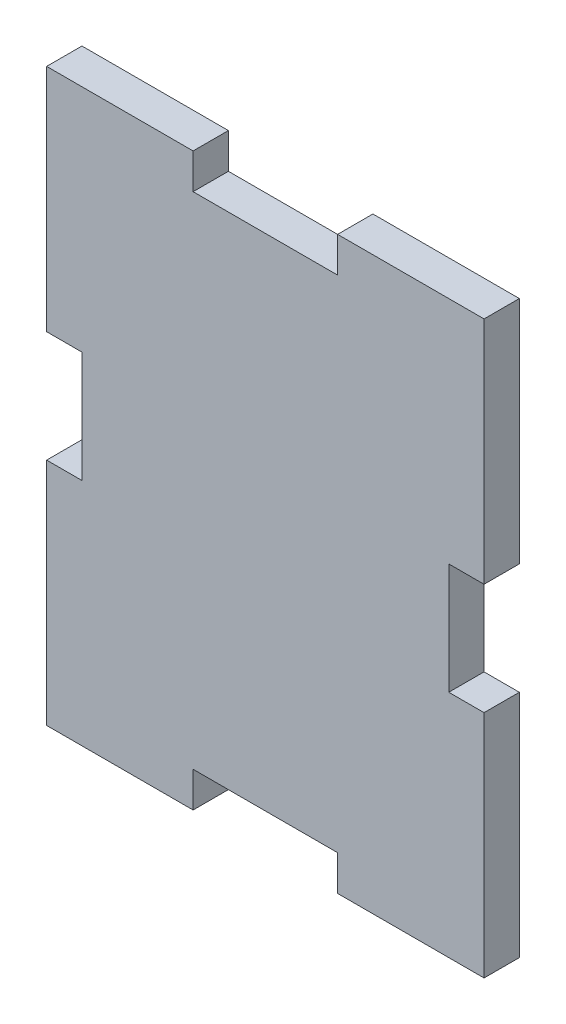
ISO-10303-21;
HEADER;
FILE_DESCRIPTION(('STEP AP214'),'2;1');
FILE_NAME('part.step','',(''),(''),'','','');
FILE_SCHEMA(('AUTOMOTIVE_DESIGN { 1 0 10303 214 1 1 1 1 }'));
ENDSEC;
DATA;
#1=APPLICATION_CONTEXT('core data for automotive mechanical design processes');
#2=APPLICATION_PROTOCOL_DEFINITION('international standard','automotive_design',2000,#1);
#3=PRODUCT_CONTEXT('',#1,'mechanical');
#4=PRODUCT('Part','Part','',(#3));
#5=PRODUCT_RELATED_PRODUCT_CATEGORY('part','',(#4));
#6=PRODUCT_DEFINITION_FORMATION('','',#4);
#7=PRODUCT_DEFINITION_CONTEXT('part definition',#1,'design');
#8=PRODUCT_DEFINITION('design','',#6,#7);
#9=PRODUCT_DEFINITION_SHAPE('','',#8);
#10=(LENGTH_UNIT() NAMED_UNIT(*) SI_UNIT(.MILLI.,.METRE.));
#11=(NAMED_UNIT(*) PLANE_ANGLE_UNIT() SI_UNIT($,.RADIAN.));
#12=(NAMED_UNIT(*) SI_UNIT($,.STERADIAN.) SOLID_ANGLE_UNIT());
#13=UNCERTAINTY_MEASURE_WITH_UNIT(LENGTH_MEASURE(1.E-05),#10,'distance_accuracy_value','');
#14=(GEOMETRIC_REPRESENTATION_CONTEXT(3) GLOBAL_UNCERTAINTY_ASSIGNED_CONTEXT((#13)) GLOBAL_UNIT_ASSIGNED_CONTEXT((#10,
#11,#12)) REPRESENTATION_CONTEXT('',''));
#15=CARTESIAN_POINT('',(0.,0.,0.));
#16=DIRECTION('',(0.,0.,1.));
#17=DIRECTION('',(1.,0.,0.));
#18=AXIS2_PLACEMENT_3D('',#15,#16,#17);
#19=CARTESIAN_POINT('',(0.,0.,6.35));
#20=DIRECTION('',(0.,1.,0.));
#21=DIRECTION('',(0.,0.,1.));
#22=AXIS2_PLACEMENT_3D('',#19,#20,#21);
#23=PLANE('',#22);
#24=DIRECTION('',(1.,0.,0.));
#25=VECTOR('',#24,1.);
#26=CARTESIAN_POINT('',(0.,0.,0.));
#27=LINE('',#26,#25);
#28=CARTESIAN_POINT('',(0.,0.,0.));
#29=VERTEX_POINT('',#28);
#30=CARTESIAN_POINT('',(26.35,0.,0.));
#31=VERTEX_POINT('',#30);
#32=EDGE_CURVE('E201',#29,#31,#27,.T.);
#33=ORIENTED_EDGE('',*,*,#32,.T.);
#34=DIRECTION('',(0.,0.,-1.));
#35=VECTOR('',#34,1.);
#36=CARTESIAN_POINT('',(26.35,0.,6.35));
#37=LINE('',#36,#35);
#38=CARTESIAN_POINT('',(26.35,0.,6.35));
#39=VERTEX_POINT('',#38);
#40=EDGE_CURVE('E11',#39,#31,#37,.T.);
#41=ORIENTED_EDGE('',*,*,#40,.F.);
#42=DIRECTION('',(1.,0.,0.));
#43=VECTOR('',#42,1.);
#44=CARTESIAN_POINT('',(0.,0.,6.35));
#45=LINE('',#44,#43);
#46=CARTESIAN_POINT('',(0.,0.,6.35));
#47=VERTEX_POINT('',#46);
#48=EDGE_CURVE('E239',#47,#39,#45,.T.);
#49=ORIENTED_EDGE('',*,*,#48,.F.);
#50=DIRECTION('',(0.,0.,-1.));
#51=VECTOR('',#50,1.);
#52=CARTESIAN_POINT('',(0.,0.,6.35));
#53=LINE('',#52,#51);
#54=EDGE_CURVE('E197',#47,#29,#53,.T.);
#55=ORIENTED_EDGE('',*,*,#54,.T.);
#56=EDGE_LOOP('',(#33,#41,#49,#55));
#57=FACE_BOUND('',#56,.T.);
#58=ADVANCED_FACE('F33',(#57),#23,.F.);
#59=CARTESIAN_POINT('',(26.35,0.,6.35));
#60=DIRECTION('',(-1.,0.,0.));
#61=DIRECTION('',(0.,0.,1.));
#62=AXIS2_PLACEMENT_3D('',#59,#60,#61);
#63=PLANE('',#62);
#64=DIRECTION('',(0.,1.,0.));
#65=VECTOR('',#64,1.);
#66=CARTESIAN_POINT('',(26.35,0.,0.));
#67=LINE('',#66,#65);
#68=CARTESIAN_POINT('',(26.35,6.35,0.));
#69=VERTEX_POINT('',#68);
#70=EDGE_CURVE('E204',#31,#69,#67,.T.);
#71=ORIENTED_EDGE('',*,*,#70,.T.);
#72=DIRECTION('',(0.,0.,-1.));
#73=VECTOR('',#72,1.);
#74=CARTESIAN_POINT('',(26.35,6.35,6.35));
#75=LINE('',#74,#73);
#76=CARTESIAN_POINT('',(26.35,6.35,6.35));
#77=VERTEX_POINT('',#76);
#78=EDGE_CURVE('E41',#77,#69,#75,.T.);
#79=ORIENTED_EDGE('',*,*,#78,.F.);
#80=DIRECTION('',(0.,1.,0.));
#81=VECTOR('',#80,1.);
#82=CARTESIAN_POINT('',(26.35,0.,6.35));
#83=LINE('',#82,#81);
#84=EDGE_CURVE('E128',#39,#77,#83,.T.);
#85=ORIENTED_EDGE('',*,*,#84,.F.);
#86=ORIENTED_EDGE('',*,*,#40,.T.);
#87=EDGE_LOOP('',(#71,#79,#85,#86));
#88=FACE_BOUND('',#87,.T.);
#89=ADVANCED_FACE('F357',(#88),#63,.F.);
#90=CARTESIAN_POINT('',(26.35,6.35,6.35));
#91=DIRECTION('',(0.,1.,0.));
#92=DIRECTION('',(-1.,0.,0.));
#93=AXIS2_PLACEMENT_3D('',#90,#91,#92);
#94=PLANE('',#93);
#95=DIRECTION('',(1.,0.,0.));
#96=VECTOR('',#95,1.);
#97=CARTESIAN_POINT('',(26.35,6.35,0.));
#98=LINE('',#97,#96);
#99=CARTESIAN_POINT('',(52.35,6.35,0.));
#100=VERTEX_POINT('',#99);
#101=EDGE_CURVE('E206',#69,#100,#98,.T.);
#102=ORIENTED_EDGE('',*,*,#101,.T.);
#103=DIRECTION('',(0.,0.,-1.));
#104=VECTOR('',#103,1.);
#105=CARTESIAN_POINT('',(52.35,6.35,6.35));
#106=LINE('',#105,#104);
#107=CARTESIAN_POINT('',(52.35,6.35,6.35));
#108=VERTEX_POINT('',#107);
#109=EDGE_CURVE('E282',#108,#100,#106,.T.);
#110=ORIENTED_EDGE('',*,*,#109,.F.);
#111=DIRECTION('',(1.,0.,0.));
#112=VECTOR('',#111,1.);
#113=CARTESIAN_POINT('',(26.35,6.35,6.35));
#114=LINE('',#113,#112);
#115=EDGE_CURVE('E290',#77,#108,#114,.T.);
#116=ORIENTED_EDGE('',*,*,#115,.F.);
#117=ORIENTED_EDGE('',*,*,#78,.T.);
#118=EDGE_LOOP('',(#102,#110,#116,#117));
#119=FACE_BOUND('',#118,.T.);
#120=ADVANCED_FACE('F288',(#119),#94,.F.);
#121=CARTESIAN_POINT('',(52.35,6.35,6.35));
#122=DIRECTION('',(1.,0.,0.));
#123=DIRECTION('',(0.,1.,0.));
#124=AXIS2_PLACEMENT_3D('',#121,#122,#123);
#125=PLANE('',#124);
#126=DIRECTION('',(0.,-1.,0.));
#127=VECTOR('',#126,1.);
#128=CARTESIAN_POINT('',(52.35,6.35,0.));
#129=LINE('',#128,#127);
#130=CARTESIAN_POINT('',(52.35,0.,0.));
#131=VERTEX_POINT('',#130);
#132=EDGE_CURVE('E208',#100,#131,#129,.T.);
#133=ORIENTED_EDGE('',*,*,#132,.T.);
#134=DIRECTION('',(0.,0.,-1.));
#135=VECTOR('',#134,1.);
#136=CARTESIAN_POINT('',(52.35,0.,6.35));
#137=LINE('',#136,#135);
#138=CARTESIAN_POINT('',(52.35,0.,6.35));
#139=VERTEX_POINT('',#138);
#140=EDGE_CURVE('E279',#139,#131,#137,.T.);
#141=ORIENTED_EDGE('',*,*,#140,.F.);
#142=DIRECTION('',(0.,-1.,0.));
#143=VECTOR('',#142,1.);
#144=CARTESIAN_POINT('',(52.35,6.35,6.35));
#145=LINE('',#144,#143);
#146=EDGE_CURVE('E308',#108,#139,#145,.T.);
#147=ORIENTED_EDGE('',*,*,#146,.F.);
#148=ORIENTED_EDGE('',*,*,#109,.T.);
#149=EDGE_LOOP('',(#133,#141,#147,#148));
#150=FACE_BOUND('',#149,.T.);
#151=ADVANCED_FACE('F299',(#150),#125,.F.);
#152=CARTESIAN_POINT('',(52.35,0.,6.35));
#153=DIRECTION('',(0.,1.,0.));
#154=DIRECTION('',(0.,0.,1.));
#155=AXIS2_PLACEMENT_3D('',#152,#153,#154);
#156=PLANE('',#155);
#157=DIRECTION('',(1.,0.,0.));
#158=VECTOR('',#157,1.);
#159=CARTESIAN_POINT('',(52.35,0.,0.));
#160=LINE('',#159,#158);
#161=CARTESIAN_POINT('',(78.7,0.,0.));
#162=VERTEX_POINT('',#161);
#163=EDGE_CURVE('E210',#131,#162,#160,.T.);
#164=ORIENTED_EDGE('',*,*,#163,.T.);
#165=DIRECTION('',(0.,0.,-1.));
#166=VECTOR('',#165,1.);
#167=CARTESIAN_POINT('',(78.7,0.,6.35));
#168=LINE('',#167,#166);
#169=CARTESIAN_POINT('',(78.7,0.,6.35));
#170=VERTEX_POINT('',#169);
#171=EDGE_CURVE('E276',#170,#162,#168,.T.);
#172=ORIENTED_EDGE('',*,*,#171,.F.);
#173=DIRECTION('',(1.,0.,0.));
#174=VECTOR('',#173,1.);
#175=CARTESIAN_POINT('',(52.35,0.,6.35));
#176=LINE('',#175,#174);
#177=EDGE_CURVE('E305',#139,#170,#176,.T.);
#178=ORIENTED_EDGE('',*,*,#177,.F.);
#179=ORIENTED_EDGE('',*,*,#140,.T.);
#180=EDGE_LOOP('',(#164,#172,#178,#179));
#181=FACE_BOUND('',#180,.T.);
#182=ADVANCED_FACE('F303',(#181),#156,.F.);
#183=CARTESIAN_POINT('',(78.7,41.35,6.35));
#184=DIRECTION('',(-1.,0.,0.));
#185=DIRECTION('',(0.,0.,1.));
#186=AXIS2_PLACEMENT_3D('',#183,#184,#185);
#187=PLANE('',#186);
#188=DIRECTION('',(0.,1.,0.));
#189=VECTOR('',#188,1.);
#190=CARTESIAN_POINT('',(78.7,41.35,0.));
#191=LINE('',#190,#189);
#192=CARTESIAN_POINT('',(78.7,41.35,0.));
#193=VERTEX_POINT('',#192);
#194=EDGE_CURVE('E212',#162,#193,#191,.T.);
#195=ORIENTED_EDGE('',*,*,#194,.T.);
#196=DIRECTION('',(0.,0.,-1.));
#197=VECTOR('',#196,1.);
#198=CARTESIAN_POINT('',(78.7,41.35,6.35));
#199=LINE('',#198,#197);
#200=CARTESIAN_POINT('',(78.7,41.35,6.35));
#201=VERTEX_POINT('',#200);
#202=EDGE_CURVE('E273',#201,#193,#199,.T.);
#203=ORIENTED_EDGE('',*,*,#202,.F.);
#204=DIRECTION('',(0.,1.,0.));
#205=VECTOR('',#204,1.);
#206=CARTESIAN_POINT('',(78.7,41.35,6.35));
#207=LINE('',#206,#205);
#208=EDGE_CURVE('E307',#170,#201,#207,.T.);
#209=ORIENTED_EDGE('',*,*,#208,.F.);
#210=ORIENTED_EDGE('',*,*,#171,.T.);
#211=EDGE_LOOP('',(#195,#203,#209,#210));
#212=FACE_BOUND('',#211,.T.);
#213=ADVANCED_FACE('F370',(#212),#187,.F.);
#214=CARTESIAN_POINT('',(72.35,41.35,6.35));
#215=DIRECTION('',(0.,-1.,0.));
#216=DIRECTION('',(0.,0.,-1.));
#217=AXIS2_PLACEMENT_3D('',#214,#215,#216);
#218=PLANE('',#217);
#219=DIRECTION('',(-1.,0.,0.));
#220=VECTOR('',#219,1.);
#221=CARTESIAN_POINT('',(72.35,41.35,0.));
#222=LINE('',#221,#220);
#223=CARTESIAN_POINT('',(72.35,41.35,0.));
#224=VERTEX_POINT('',#223);
#225=EDGE_CURVE('E214',#193,#224,#222,.T.);
#226=ORIENTED_EDGE('',*,*,#225,.T.);
#227=DIRECTION('',(0.,0.,-1.));
#228=VECTOR('',#227,1.);
#229=CARTESIAN_POINT('',(72.35,41.35,6.35));
#230=LINE('',#229,#228);
#231=CARTESIAN_POINT('',(72.35,41.35,6.35));
#232=VERTEX_POINT('',#231);
#233=EDGE_CURVE('E270',#232,#224,#230,.T.);
#234=ORIENTED_EDGE('',*,*,#233,.F.);
#235=DIRECTION('',(-1.,0.,0.));
#236=VECTOR('',#235,1.);
#237=CARTESIAN_POINT('',(72.35,41.35,6.35));
#238=LINE('',#237,#236);
#239=EDGE_CURVE('E310',#201,#232,#238,.T.);
#240=ORIENTED_EDGE('',*,*,#239,.F.);
#241=ORIENTED_EDGE('',*,*,#202,.T.);
#242=EDGE_LOOP('',(#226,#234,#240,#241));
#243=FACE_BOUND('',#242,.T.);
#244=ADVANCED_FACE('F373',(#243),#218,.F.);
#245=CARTESIAN_POINT('',(72.35,61.35,6.35));
#246=DIRECTION('',(-1.,0.,0.));
#247=DIRECTION('',(0.,0.,1.));
#248=AXIS2_PLACEMENT_3D('',#245,#246,#247);
#249=PLANE('',#248);
#250=DIRECTION('',(0.,1.,0.));
#251=VECTOR('',#250,1.);
#252=CARTESIAN_POINT('',(72.35,61.35,0.));
#253=LINE('',#252,#251);
#254=CARTESIAN_POINT('',(72.35,61.35,0.));
#255=VERTEX_POINT('',#254);
#256=EDGE_CURVE('E216',#224,#255,#253,.T.);
#257=ORIENTED_EDGE('',*,*,#256,.T.);
#258=DIRECTION('',(0.,0.,-1.));
#259=VECTOR('',#258,1.);
#260=CARTESIAN_POINT('',(72.35,61.35,6.35));
#261=LINE('',#260,#259);
#262=CARTESIAN_POINT('',(72.35,61.35,6.35));
#263=VERTEX_POINT('',#262);
#264=EDGE_CURVE('E267',#263,#255,#261,.T.);
#265=ORIENTED_EDGE('',*,*,#264,.F.);
#266=DIRECTION('',(0.,1.,0.));
#267=VECTOR('',#266,1.);
#268=CARTESIAN_POINT('',(72.35,61.35,6.35));
#269=LINE('',#268,#267);
#270=EDGE_CURVE('E316',#232,#263,#269,.T.);
#271=ORIENTED_EDGE('',*,*,#270,.F.);
#272=ORIENTED_EDGE('',*,*,#233,.T.);
#273=EDGE_LOOP('',(#257,#265,#271,#272));
#274=FACE_BOUND('',#273,.T.);
#275=ADVANCED_FACE('F377',(#274),#249,.F.);
#276=CARTESIAN_POINT('',(78.7,61.35,6.35));
#277=DIRECTION('',(0.,1.,0.));
#278=DIRECTION('',(0.,0.,1.));
#279=AXIS2_PLACEMENT_3D('',#276,#277,#278);
#280=PLANE('',#279);
#281=DIRECTION('',(1.,0.,0.));
#282=VECTOR('',#281,1.);
#283=CARTESIAN_POINT('',(78.7,61.35,0.));
#284=LINE('',#283,#282);
#285=CARTESIAN_POINT('',(78.7,61.35,0.));
#286=VERTEX_POINT('',#285);
#287=EDGE_CURVE('E218',#255,#286,#284,.T.);
#288=ORIENTED_EDGE('',*,*,#287,.T.);
#289=DIRECTION('',(0.,0.,-1.));
#290=VECTOR('',#289,1.);
#291=CARTESIAN_POINT('',(78.7,61.35,6.35));
#292=LINE('',#291,#290);
#293=CARTESIAN_POINT('',(78.7,61.35,6.35));
#294=VERTEX_POINT('',#293);
#295=EDGE_CURVE('E264',#294,#286,#292,.T.);
#296=ORIENTED_EDGE('',*,*,#295,.F.);
#297=DIRECTION('',(1.,0.,0.));
#298=VECTOR('',#297,1.);
#299=CARTESIAN_POINT('',(78.7,61.35,6.35));
#300=LINE('',#299,#298);
#301=EDGE_CURVE('E318',#263,#294,#300,.T.);
#302=ORIENTED_EDGE('',*,*,#301,.F.);
#303=ORIENTED_EDGE('',*,*,#264,.T.);
#304=EDGE_LOOP('',(#288,#296,#302,#303));
#305=FACE_BOUND('',#304,.T.);
#306=ADVANCED_FACE('F381',(#305),#280,.F.);
#307=CARTESIAN_POINT('',(78.7,102.7,6.35));
#308=DIRECTION('',(-1.,0.,0.));
#309=DIRECTION('',(0.,-1.,0.));
#310=AXIS2_PLACEMENT_3D('',#307,#308,#309);
#311=PLANE('',#310);
#312=DIRECTION('',(0.,1.,0.));
#313=VECTOR('',#312,1.);
#314=CARTESIAN_POINT('',(78.7,102.7,0.));
#315=LINE('',#314,#313);
#316=CARTESIAN_POINT('',(78.7,102.7,0.));
#317=VERTEX_POINT('',#316);
#318=EDGE_CURVE('E220',#286,#317,#315,.T.);
#319=ORIENTED_EDGE('',*,*,#318,.T.);
#320=DIRECTION('',(0.,0.,-1.));
#321=VECTOR('',#320,1.);
#322=CARTESIAN_POINT('',(78.7,102.7,6.35));
#323=LINE('',#322,#321);
#324=CARTESIAN_POINT('',(78.7,102.7,6.35));
#325=VERTEX_POINT('',#324);
#326=EDGE_CURVE('E261',#325,#317,#323,.T.);
#327=ORIENTED_EDGE('',*,*,#326,.F.);
#328=DIRECTION('',(0.,1.,0.));
#329=VECTOR('',#328,1.);
#330=CARTESIAN_POINT('',(78.7,102.7,6.35));
#331=LINE('',#330,#329);
#332=EDGE_CURVE('E320',#294,#325,#331,.T.);
#333=ORIENTED_EDGE('',*,*,#332,.F.);
#334=ORIENTED_EDGE('',*,*,#295,.T.);
#335=EDGE_LOOP('',(#319,#327,#333,#334));
#336=FACE_BOUND('',#335,.T.);
#337=ADVANCED_FACE('F385',(#336),#311,.F.);
#338=CARTESIAN_POINT('',(52.35,102.7,6.35));
#339=DIRECTION('',(0.,-1.,0.));
#340=DIRECTION('',(0.,0.,-1.));
#341=AXIS2_PLACEMENT_3D('',#338,#339,#340);
#342=PLANE('',#341);
#343=DIRECTION('',(-1.,0.,0.));
#344=VECTOR('',#343,1.);
#345=CARTESIAN_POINT('',(52.35,102.7,0.));
#346=LINE('',#345,#344);
#347=CARTESIAN_POINT('',(52.35,102.7,0.));
#348=VERTEX_POINT('',#347);
#349=EDGE_CURVE('E222',#317,#348,#346,.T.);
#350=ORIENTED_EDGE('',*,*,#349,.T.);
#351=DIRECTION('',(0.,0.,-1.));
#352=VECTOR('',#351,1.);
#353=CARTESIAN_POINT('',(52.35,102.7,6.35));
#354=LINE('',#353,#352);
#355=CARTESIAN_POINT('',(52.35,102.7,6.35));
#356=VERTEX_POINT('',#355);
#357=EDGE_CURVE('E258',#356,#348,#354,.T.);
#358=ORIENTED_EDGE('',*,*,#357,.F.);
#359=DIRECTION('',(-1.,0.,0.));
#360=VECTOR('',#359,1.);
#361=CARTESIAN_POINT('',(52.35,102.7,6.35));
#362=LINE('',#361,#360);
#363=EDGE_CURVE('E322',#325,#356,#362,.T.);
#364=ORIENTED_EDGE('',*,*,#363,.F.);
#365=ORIENTED_EDGE('',*,*,#326,.T.);
#366=EDGE_LOOP('',(#350,#358,#364,#365));
#367=FACE_BOUND('',#366,.T.);
#368=ADVANCED_FACE('F389',(#367),#342,.F.);
#369=CARTESIAN_POINT('',(52.35,96.35,6.35));
#370=DIRECTION('',(1.,0.,0.));
#371=DIRECTION('',(0.,0.,-1.));
#372=AXIS2_PLACEMENT_3D('',#369,#370,#371);
#373=PLANE('',#372);
#374=DIRECTION('',(0.,-1.,0.));
#375=VECTOR('',#374,1.);
#376=CARTESIAN_POINT('',(52.35,96.35,0.));
#377=LINE('',#376,#375);
#378=CARTESIAN_POINT('',(52.35,96.35,0.));
#379=VERTEX_POINT('',#378);
#380=EDGE_CURVE('E224',#348,#379,#377,.T.);
#381=ORIENTED_EDGE('',*,*,#380,.T.);
#382=DIRECTION('',(0.,0.,-1.));
#383=VECTOR('',#382,1.);
#384=CARTESIAN_POINT('',(52.35,96.35,6.35));
#385=LINE('',#384,#383);
#386=CARTESIAN_POINT('',(52.35,96.35,6.35));
#387=VERTEX_POINT('',#386);
#388=EDGE_CURVE('E255',#387,#379,#385,.T.);
#389=ORIENTED_EDGE('',*,*,#388,.F.);
#390=DIRECTION('',(0.,-1.,0.));
#391=VECTOR('',#390,1.);
#392=CARTESIAN_POINT('',(52.35,96.35,6.35));
#393=LINE('',#392,#391);
#394=EDGE_CURVE('E324',#356,#387,#393,.T.);
#395=ORIENTED_EDGE('',*,*,#394,.F.);
#396=ORIENTED_EDGE('',*,*,#357,.T.);
#397=EDGE_LOOP('',(#381,#389,#395,#396));
#398=FACE_BOUND('',#397,.T.);
#399=ADVANCED_FACE('F393',(#398),#373,.F.);
#400=CARTESIAN_POINT('',(26.35,96.35,6.35));
#401=DIRECTION('',(0.,-1.,0.));
#402=DIRECTION('',(1.,0.,0.));
#403=AXIS2_PLACEMENT_3D('',#400,#401,#402);
#404=PLANE('',#403);
#405=DIRECTION('',(-1.,0.,0.));
#406=VECTOR('',#405,1.);
#407=CARTESIAN_POINT('',(26.35,96.35,0.));
#408=LINE('',#407,#406);
#409=CARTESIAN_POINT('',(26.35,96.35,0.));
#410=VERTEX_POINT('',#409);
#411=EDGE_CURVE('E226',#379,#410,#408,.T.);
#412=ORIENTED_EDGE('',*,*,#411,.T.);
#413=DIRECTION('',(0.,0.,-1.));
#414=VECTOR('',#413,1.);
#415=CARTESIAN_POINT('',(26.35,96.35,6.35));
#416=LINE('',#415,#414);
#417=CARTESIAN_POINT('',(26.35,96.35,6.35));
#418=VERTEX_POINT('',#417);
#419=EDGE_CURVE('E252',#418,#410,#416,.T.);
#420=ORIENTED_EDGE('',*,*,#419,.F.);
#421=DIRECTION('',(-1.,0.,0.));
#422=VECTOR('',#421,1.);
#423=CARTESIAN_POINT('',(26.35,96.35,6.35));
#424=LINE('',#423,#422);
#425=EDGE_CURVE('E326',#387,#418,#424,.T.);
#426=ORIENTED_EDGE('',*,*,#425,.F.);
#427=ORIENTED_EDGE('',*,*,#388,.T.);
#428=EDGE_LOOP('',(#412,#420,#426,#427));
#429=FACE_BOUND('',#428,.T.);
#430=ADVANCED_FACE('F397',(#429),#404,.F.);
#431=CARTESIAN_POINT('',(26.35,102.7,6.35));
#432=DIRECTION('',(-1.,0.,0.));
#433=DIRECTION('',(0.,0.,1.));
#434=AXIS2_PLACEMENT_3D('',#431,#432,#433);
#435=PLANE('',#434);
#436=DIRECTION('',(0.,1.,0.));
#437=VECTOR('',#436,1.);
#438=CARTESIAN_POINT('',(26.35,102.7,0.));
#439=LINE('',#438,#437);
#440=CARTESIAN_POINT('',(26.35,102.7,0.));
#441=VERTEX_POINT('',#440);
#442=EDGE_CURVE('E228',#410,#441,#439,.T.);
#443=ORIENTED_EDGE('',*,*,#442,.T.);
#444=DIRECTION('',(0.,0.,-1.));
#445=VECTOR('',#444,1.);
#446=CARTESIAN_POINT('',(26.35,102.7,6.35));
#447=LINE('',#446,#445);
#448=CARTESIAN_POINT('',(26.35,102.7,6.35));
#449=VERTEX_POINT('',#448);
#450=EDGE_CURVE('E249',#449,#441,#447,.T.);
#451=ORIENTED_EDGE('',*,*,#450,.F.);
#452=DIRECTION('',(0.,1.,0.));
#453=VECTOR('',#452,1.);
#454=CARTESIAN_POINT('',(26.35,102.7,6.35));
#455=LINE('',#454,#453);
#456=EDGE_CURVE('E328',#418,#449,#455,.T.);
#457=ORIENTED_EDGE('',*,*,#456,.F.);
#458=ORIENTED_EDGE('',*,*,#419,.T.);
#459=EDGE_LOOP('',(#443,#451,#457,#458));
#460=FACE_BOUND('',#459,.T.);
#461=ADVANCED_FACE('F401',(#460),#435,.F.);
#462=CARTESIAN_POINT('',(0.,102.7,6.35));
#463=DIRECTION('',(0.,-1.,0.));
#464=DIRECTION('',(0.,0.,-1.));
#465=AXIS2_PLACEMENT_3D('',#462,#463,#464);
#466=PLANE('',#465);
#467=DIRECTION('',(-1.,0.,0.));
#468=VECTOR('',#467,1.);
#469=CARTESIAN_POINT('',(0.,102.7,0.));
#470=LINE('',#469,#468);
#471=CARTESIAN_POINT('',(0.,102.7,0.));
#472=VERTEX_POINT('',#471);
#473=EDGE_CURVE('E230',#441,#472,#470,.T.);
#474=ORIENTED_EDGE('',*,*,#473,.T.);
#475=DIRECTION('',(0.,0.,-1.));
#476=VECTOR('',#475,1.);
#477=CARTESIAN_POINT('',(0.,102.7,6.35));
#478=LINE('',#477,#476);
#479=CARTESIAN_POINT('',(0.,102.7,6.35));
#480=VERTEX_POINT('',#479);
#481=EDGE_CURVE('E246',#480,#472,#478,.T.);
#482=ORIENTED_EDGE('',*,*,#481,.F.);
#483=DIRECTION('',(-1.,0.,0.));
#484=VECTOR('',#483,1.);
#485=CARTESIAN_POINT('',(0.,102.7,6.35));
#486=LINE('',#485,#484);
#487=EDGE_CURVE('E330',#449,#480,#486,.T.);
#488=ORIENTED_EDGE('',*,*,#487,.F.);
#489=ORIENTED_EDGE('',*,*,#450,.T.);
#490=EDGE_LOOP('',(#474,#482,#488,#489));
#491=FACE_BOUND('',#490,.T.);
#492=ADVANCED_FACE('F405',(#491),#466,.F.);
#493=CARTESIAN_POINT('',(0.,61.35,6.35));
#494=DIRECTION('',(1.,0.,0.));
#495=DIRECTION('',(0.,0.,-1.));
#496=AXIS2_PLACEMENT_3D('',#493,#494,#495);
#497=PLANE('',#496);
#498=DIRECTION('',(0.,-1.,0.));
#499=VECTOR('',#498,1.);
#500=CARTESIAN_POINT('',(0.,61.35,0.));
#501=LINE('',#500,#499);
#502=CARTESIAN_POINT('',(0.,61.35,0.));
#503=VERTEX_POINT('',#502);
#504=EDGE_CURVE('E232',#472,#503,#501,.T.);
#505=ORIENTED_EDGE('',*,*,#504,.T.);
#506=DIRECTION('',(0.,0.,-1.));
#507=VECTOR('',#506,1.);
#508=CARTESIAN_POINT('',(0.,61.35,6.35));
#509=LINE('',#508,#507);
#510=CARTESIAN_POINT('',(0.,61.35,6.35));
#511=VERTEX_POINT('',#510);
#512=EDGE_CURVE('E243',#511,#503,#509,.T.);
#513=ORIENTED_EDGE('',*,*,#512,.F.);
#514=DIRECTION('',(0.,-1.,0.));
#515=VECTOR('',#514,1.);
#516=CARTESIAN_POINT('',(0.,61.35,6.35));
#517=LINE('',#516,#515);
#518=EDGE_CURVE('E332',#480,#511,#517,.T.);
#519=ORIENTED_EDGE('',*,*,#518,.F.);
#520=ORIENTED_EDGE('',*,*,#481,.T.);
#521=EDGE_LOOP('',(#505,#513,#519,#520));
#522=FACE_BOUND('',#521,.T.);
#523=ADVANCED_FACE('F338',(#522),#497,.F.);
#524=CARTESIAN_POINT('',(6.35,61.35,6.35));
#525=DIRECTION('',(0.,1.,0.));
#526=DIRECTION('',(0.,0.,1.));
#527=AXIS2_PLACEMENT_3D('',#524,#525,#526);
#528=PLANE('',#527);
#529=DIRECTION('',(1.,0.,0.));
#530=VECTOR('',#529,1.);
#531=CARTESIAN_POINT('',(6.35,61.35,0.));
#532=LINE('',#531,#530);
#533=CARTESIAN_POINT('',(6.35,61.35,0.));
#534=VERTEX_POINT('',#533);
#535=EDGE_CURVE('E234',#503,#534,#532,.T.);
#536=ORIENTED_EDGE('',*,*,#535,.T.);
#537=DIRECTION('',(0.,0.,-1.));
#538=VECTOR('',#537,1.);
#539=CARTESIAN_POINT('',(6.35,61.35,6.35));
#540=LINE('',#539,#538);
#541=CARTESIAN_POINT('',(6.35,61.35,6.35));
#542=VERTEX_POINT('',#541);
#543=EDGE_CURVE('E192',#542,#534,#540,.T.);
#544=ORIENTED_EDGE('',*,*,#543,.F.);
#545=DIRECTION('',(1.,0.,0.));
#546=VECTOR('',#545,1.);
#547=CARTESIAN_POINT('',(6.35,61.35,6.35));
#548=LINE('',#547,#546);
#549=EDGE_CURVE('E183',#511,#542,#548,.T.);
#550=ORIENTED_EDGE('',*,*,#549,.F.);
#551=ORIENTED_EDGE('',*,*,#512,.T.);
#552=EDGE_LOOP('',(#536,#544,#550,#551));
#553=FACE_BOUND('',#552,.T.);
#554=ADVANCED_FACE('F342',(#553),#528,.F.);
#555=CARTESIAN_POINT('',(6.35,41.35,6.35));
#556=DIRECTION('',(1.,0.,0.));
#557=DIRECTION('',(0.,1.,0.));
#558=AXIS2_PLACEMENT_3D('',#555,#556,#557);
#559=PLANE('',#558);
#560=DIRECTION('',(0.,-1.,0.));
#561=VECTOR('',#560,1.);
#562=CARTESIAN_POINT('',(6.35,41.35,0.));
#563=LINE('',#562,#561);
#564=CARTESIAN_POINT('',(6.35,41.35,0.));
#565=VERTEX_POINT('',#564);
#566=EDGE_CURVE('E191',#534,#565,#563,.T.);
#567=ORIENTED_EDGE('',*,*,#566,.T.);
#568=DIRECTION('',(0.,0.,-1.));
#569=VECTOR('',#568,1.);
#570=CARTESIAN_POINT('',(6.35,41.35,6.35));
#571=LINE('',#570,#569);
#572=CARTESIAN_POINT('',(6.35,41.35,6.35));
#573=VERTEX_POINT('',#572);
#574=EDGE_CURVE('E188',#573,#565,#571,.T.);
#575=ORIENTED_EDGE('',*,*,#574,.F.);
#576=DIRECTION('',(0.,-1.,0.));
#577=VECTOR('',#576,1.);
#578=CARTESIAN_POINT('',(6.35,41.35,6.35));
#579=LINE('',#578,#577);
#580=EDGE_CURVE('E177',#542,#573,#579,.T.);
#581=ORIENTED_EDGE('',*,*,#580,.F.);
#582=ORIENTED_EDGE('',*,*,#543,.T.);
#583=EDGE_LOOP('',(#567,#575,#581,#582));
#584=FACE_BOUND('',#583,.T.);
#585=ADVANCED_FACE('F189',(#584),#559,.F.);
#586=CARTESIAN_POINT('',(0.,41.35,6.35));
#587=DIRECTION('',(0.,-1.,0.));
#588=DIRECTION('',(0.,0.,-1.));
#589=AXIS2_PLACEMENT_3D('',#586,#587,#588);
#590=PLANE('',#589);
#591=DIRECTION('',(-1.,0.,0.));
#592=VECTOR('',#591,1.);
#593=CARTESIAN_POINT('',(0.,41.35,0.));
#594=LINE('',#593,#592);
#595=CARTESIAN_POINT('',(0.,41.35,0.));
#596=VERTEX_POINT('',#595);
#597=EDGE_CURVE('E114',#565,#596,#594,.T.);
#598=ORIENTED_EDGE('',*,*,#597,.T.);
#599=DIRECTION('',(0.,0.,-1.));
#600=VECTOR('',#599,1.);
#601=CARTESIAN_POINT('',(0.,41.35,6.35));
#602=LINE('',#601,#600);
#603=CARTESIAN_POINT('',(0.,41.35,6.35));
#604=VERTEX_POINT('',#603);
#605=EDGE_CURVE('E193',#604,#596,#602,.T.);
#606=ORIENTED_EDGE('',*,*,#605,.F.);
#607=DIRECTION('',(-1.,0.,0.));
#608=VECTOR('',#607,1.);
#609=CARTESIAN_POINT('',(0.,41.35,6.35));
#610=LINE('',#609,#608);
#611=EDGE_CURVE('E181',#573,#604,#610,.T.);
#612=ORIENTED_EDGE('',*,*,#611,.F.);
#613=ORIENTED_EDGE('',*,*,#574,.T.);
#614=EDGE_LOOP('',(#598,#606,#612,#613));
#615=FACE_BOUND('',#614,.T.);
#616=ADVANCED_FACE('F195',(#615),#590,.F.);
#617=CARTESIAN_POINT('',(0.,0.,6.35));
#618=DIRECTION('',(1.,0.,0.));
#619=DIRECTION('',(0.,0.,-1.));
#620=AXIS2_PLACEMENT_3D('',#617,#618,#619);
#621=PLANE('',#620);
#622=DIRECTION('',(0.,-1.,0.));
#623=VECTOR('',#622,1.);
#624=CARTESIAN_POINT('',(0.,0.,0.));
#625=LINE('',#624,#623);
#626=EDGE_CURVE('E120',#596,#29,#625,.T.);
#627=ORIENTED_EDGE('',*,*,#626,.T.);
#628=ORIENTED_EDGE('',*,*,#54,.F.);
#629=DIRECTION('',(0.,-1.,0.));
#630=VECTOR('',#629,1.);
#631=CARTESIAN_POINT('',(0.,0.,6.35));
#632=LINE('',#631,#630);
#633=EDGE_CURVE('E49',#604,#47,#632,.T.);
#634=ORIENTED_EDGE('',*,*,#633,.F.);
#635=ORIENTED_EDGE('',*,*,#605,.T.);
#636=EDGE_LOOP('',(#627,#628,#634,#635));
#637=FACE_BOUND('',#636,.T.);
#638=ADVANCED_FACE('F346',(#637),#621,.F.);
#639=CARTESIAN_POINT('',(0.,0.,6.35));
#640=DIRECTION('',(0.,0.,1.));
#641=DIRECTION('',(1.,0.,0.));
#642=AXIS2_PLACEMENT_3D('',#639,#640,#641);
#643=PLANE('',#642);
#644=ORIENTED_EDGE('',*,*,#48,.T.);
#645=ORIENTED_EDGE('',*,*,#84,.T.);
#646=ORIENTED_EDGE('',*,*,#115,.T.);
#647=ORIENTED_EDGE('',*,*,#146,.T.);
#648=ORIENTED_EDGE('',*,*,#177,.T.);
#649=ORIENTED_EDGE('',*,*,#208,.T.);
#650=ORIENTED_EDGE('',*,*,#239,.T.);
#651=ORIENTED_EDGE('',*,*,#270,.T.);
#652=ORIENTED_EDGE('',*,*,#301,.T.);
#653=ORIENTED_EDGE('',*,*,#332,.T.);
#654=ORIENTED_EDGE('',*,*,#363,.T.);
#655=ORIENTED_EDGE('',*,*,#394,.T.);
#656=ORIENTED_EDGE('',*,*,#425,.T.);
#657=ORIENTED_EDGE('',*,*,#456,.T.);
#658=ORIENTED_EDGE('',*,*,#487,.T.);
#659=ORIENTED_EDGE('',*,*,#518,.T.);
#660=ORIENTED_EDGE('',*,*,#549,.T.);
#661=ORIENTED_EDGE('',*,*,#580,.T.);
#662=ORIENTED_EDGE('',*,*,#611,.T.);
#663=ORIENTED_EDGE('',*,*,#633,.T.);
#664=EDGE_LOOP('',(#644,#645,#646,#647,#648,#649,#650,#651,#652,#653,#654,#655,#656,#657,#658,
#659,#660,#661,#662,#663));
#665=FACE_BOUND('',#664,.T.);
#666=ADVANCED_FACE('F179',(#665),#643,.T.);
#667=CARTESIAN_POINT('',(0.,0.,0.));
#668=DIRECTION('',(0.,0.,1.));
#669=DIRECTION('',(1.,0.,0.));
#670=AXIS2_PLACEMENT_3D('',#667,#668,#669);
#671=PLANE('',#670);
#672=ORIENTED_EDGE('',*,*,#32,.F.);
#673=ORIENTED_EDGE('',*,*,#626,.F.);
#674=ORIENTED_EDGE('',*,*,#597,.F.);
#675=ORIENTED_EDGE('',*,*,#566,.F.);
#676=ORIENTED_EDGE('',*,*,#535,.F.);
#677=ORIENTED_EDGE('',*,*,#504,.F.);
#678=ORIENTED_EDGE('',*,*,#473,.F.);
#679=ORIENTED_EDGE('',*,*,#442,.F.);
#680=ORIENTED_EDGE('',*,*,#411,.F.);
#681=ORIENTED_EDGE('',*,*,#380,.F.);
#682=ORIENTED_EDGE('',*,*,#349,.F.);
#683=ORIENTED_EDGE('',*,*,#318,.F.);
#684=ORIENTED_EDGE('',*,*,#287,.F.);
#685=ORIENTED_EDGE('',*,*,#256,.F.);
#686=ORIENTED_EDGE('',*,*,#225,.F.);
#687=ORIENTED_EDGE('',*,*,#194,.F.);
#688=ORIENTED_EDGE('',*,*,#163,.F.);
#689=ORIENTED_EDGE('',*,*,#132,.F.);
#690=ORIENTED_EDGE('',*,*,#101,.F.);
#691=ORIENTED_EDGE('',*,*,#70,.F.);
#692=EDGE_LOOP('',(#672,#673,#674,#675,#676,#677,#678,#679,#680,#681,#682,#683,#684,#685,#686,
#687,#688,#689,#690,#691));
#693=FACE_BOUND('',#692,.T.);
#694=ADVANCED_FACE('F294',(#693),#671,.F.);
#695=CLOSED_SHELL('',(#58,#89,#120,#151,#182,#213,#244,#275,#306,#337,#368,#399,#430,#461,#492,
#523,#554,#585,#616,#638,#666,#694));
#696=MANIFOLD_SOLID_BREP('B2',#695);
#697=ADVANCED_BREP_SHAPE_REPRESENTATION('',(#18,#696),#14);
#698=SHAPE_DEFINITION_REPRESENTATION(#9,#697);
ENDSEC;
END-ISO-10303-21;
